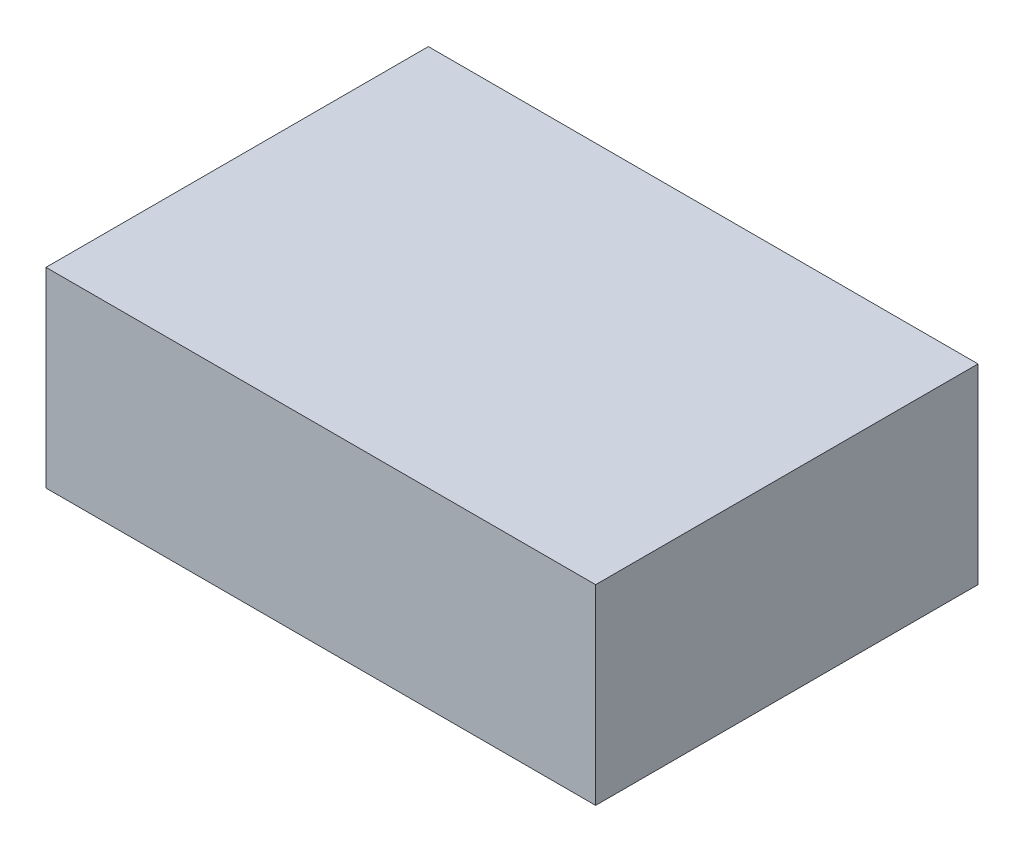
ISO-10303-21;
HEADER;
FILE_DESCRIPTION(('STEP AP214'),'2;1');
FILE_NAME('part.step','',(''),(''),'','','');
FILE_SCHEMA(('AUTOMOTIVE_DESIGN { 1 0 10303 214 1 1 1 1 }'));
ENDSEC;
DATA;
#1=APPLICATION_CONTEXT('core data for automotive mechanical design processes');
#2=APPLICATION_PROTOCOL_DEFINITION('international standard','automotive_design',2000,#1);
#3=PRODUCT_CONTEXT('',#1,'mechanical');
#4=PRODUCT('Part','Part','',(#3));
#5=PRODUCT_RELATED_PRODUCT_CATEGORY('part','',(#4));
#6=PRODUCT_DEFINITION_FORMATION('','',#4);
#7=PRODUCT_DEFINITION_CONTEXT('part definition',#1,'design');
#8=PRODUCT_DEFINITION('design','',#6,#7);
#9=PRODUCT_DEFINITION_SHAPE('','',#8);
#10=(LENGTH_UNIT() NAMED_UNIT(*) SI_UNIT(.MILLI.,.METRE.));
#11=(NAMED_UNIT(*) PLANE_ANGLE_UNIT() SI_UNIT($,.RADIAN.));
#12=(NAMED_UNIT(*) SI_UNIT($,.STERADIAN.) SOLID_ANGLE_UNIT());
#13=UNCERTAINTY_MEASURE_WITH_UNIT(LENGTH_MEASURE(1.E-05),#10,'distance_accuracy_value','');
#14=(GEOMETRIC_REPRESENTATION_CONTEXT(3) GLOBAL_UNCERTAINTY_ASSIGNED_CONTEXT((#13)) GLOBAL_UNIT_ASSIGNED_CONTEXT((#10,
#11,#12)) REPRESENTATION_CONTEXT('',''));
#15=CARTESIAN_POINT('',(0.,0.,0.));
#16=DIRECTION('',(0.,0.,1.));
#17=DIRECTION('',(1.,0.,0.));
#18=AXIS2_PLACEMENT_3D('',#15,#16,#17);
#19=CARTESIAN_POINT('',(0.,12.7,0.));
#20=DIRECTION('',(1.,0.,0.));
#21=DIRECTION('',(0.,0.,-1.));
#22=AXIS2_PLACEMENT_3D('',#19,#20,#21);
#23=PLANE('',#22);
#24=DIRECTION('',(0.,0.,-1.));
#25=VECTOR('',#24,1.);
#26=CARTESIAN_POINT('',(0.,-25.4,-25.4));
#27=LINE('',#26,#25);
#28=CARTESIAN_POINT('',(0.,-25.4,-25.4));
#29=VERTEX_POINT('',#28);
#30=CARTESIAN_POINT('',(0.,-25.4,-177.8));
#31=VERTEX_POINT('',#30);
#32=EDGE_CURVE('E141',#29,#31,#27,.T.);
#33=ORIENTED_EDGE('',*,*,#32,.F.);
#34=DIRECTION('',(0.,1.,0.));
#35=VECTOR('',#34,1.);
#36=CARTESIAN_POINT('',(0.,-88.9,-25.4));
#37=LINE('',#36,#35);
#38=CARTESIAN_POINT('',(0.,-88.9,-25.4));
#39=VERTEX_POINT('',#38);
#40=EDGE_CURVE('E124',#39,#29,#37,.T.);
#41=ORIENTED_EDGE('',*,*,#40,.F.);
#42=DIRECTION('',(0.,0.,-1.));
#43=VECTOR('',#42,1.);
#44=CARTESIAN_POINT('',(0.,-88.9,0.));
#45=LINE('',#44,#43);
#46=CARTESIAN_POINT('',(0.,-88.9,0.));
#47=VERTEX_POINT('',#46);
#48=EDGE_CURVE('E138',#47,#39,#45,.T.);
#49=ORIENTED_EDGE('',*,*,#48,.F.);
#50=DIRECTION('',(0.,-1.,0.));
#51=VECTOR('',#50,1.);
#52=CARTESIAN_POINT('',(0.,12.7,0.));
#53=LINE('',#52,#51);
#54=CARTESIAN_POINT('',(0.,12.7,0.));
#55=VERTEX_POINT('',#54);
#56=EDGE_CURVE('E11',#55,#47,#53,.T.);
#57=ORIENTED_EDGE('',*,*,#56,.F.);
#58=DIRECTION('',(0.,0.,1.));
#59=VECTOR('',#58,1.);
#60=CARTESIAN_POINT('',(0.,12.7,0.));
#61=LINE('',#60,#59);
#62=CARTESIAN_POINT('',(0.,12.7,-203.2));
#63=VERTEX_POINT('',#62);
#64=EDGE_CURVE('E157',#63,#55,#61,.T.);
#65=ORIENTED_EDGE('',*,*,#64,.F.);
#66=DIRECTION('',(0.,-1.,0.));
#67=VECTOR('',#66,1.);
#68=CARTESIAN_POINT('',(0.,12.7,-203.2));
#69=LINE('',#68,#67);
#70=CARTESIAN_POINT('',(0.,-88.9,-203.2));
#71=VERTEX_POINT('',#70);
#72=EDGE_CURVE('E166',#63,#71,#69,.T.);
#73=ORIENTED_EDGE('',*,*,#72,.T.);
#74=CARTESIAN_POINT('',(0.,-88.9,-177.8));
#75=VERTEX_POINT('',#74);
#76=EDGE_CURVE('E148',#75,#71,#45,.T.);
#77=ORIENTED_EDGE('',*,*,#76,.F.);
#78=DIRECTION('',(0.,-1.,0.));
#79=VECTOR('',#78,1.);
#80=CARTESIAN_POINT('',(0.,-88.9,-177.8));
#81=LINE('',#80,#79);
#82=EDGE_CURVE('E202',#31,#75,#81,.T.);
#83=ORIENTED_EDGE('',*,*,#82,.F.);
#84=EDGE_LOOP('',(#33,#41,#49,#57,#65,#73,#77,#83));
#85=FACE_BOUND('',#84,.T.);
#86=ADVANCED_FACE('F33',(#85),#23,.F.);
#87=CARTESIAN_POINT('',(0.,12.7,0.));
#88=DIRECTION('',(0.,0.,-1.));
#89=DIRECTION('',(-1.,0.,0.));
#90=AXIS2_PLACEMENT_3D('',#87,#88,#89);
#91=PLANE('',#90);
#92=ORIENTED_EDGE('',*,*,#56,.T.);
#93=DIRECTION('',(-1.,0.,0.));
#94=VECTOR('',#93,1.);
#95=CARTESIAN_POINT('',(292.1,-88.9,0.));
#96=LINE('',#95,#94);
#97=CARTESIAN_POINT('',(292.1,-88.9,0.));
#98=VERTEX_POINT('',#97);
#99=EDGE_CURVE('E146',#98,#47,#96,.T.);
#100=ORIENTED_EDGE('',*,*,#99,.F.);
#101=DIRECTION('',(0.,-1.,0.));
#102=VECTOR('',#101,1.);
#103=CARTESIAN_POINT('',(292.1,12.7,0.));
#104=LINE('',#103,#102);
#105=CARTESIAN_POINT('',(292.1,12.7,0.));
#106=VERTEX_POINT('',#105);
#107=EDGE_CURVE('E40',#106,#98,#104,.T.);
#108=ORIENTED_EDGE('',*,*,#107,.F.);
#109=DIRECTION('',(1.,0.,0.));
#110=VECTOR('',#109,1.);
#111=CARTESIAN_POINT('',(0.,12.7,0.));
#112=LINE('',#111,#110);
#113=EDGE_CURVE('E160',#55,#106,#112,.T.);
#114=ORIENTED_EDGE('',*,*,#113,.F.);
#115=EDGE_LOOP('',(#92,#100,#108,#114));
#116=FACE_BOUND('',#115,.T.);
#117=ADVANCED_FACE('F178',(#116),#91,.F.);
#118=CARTESIAN_POINT('',(292.1,12.7,0.));
#119=DIRECTION('',(-1.,0.,0.));
#120=DIRECTION('',(0.,0.,1.));
#121=AXIS2_PLACEMENT_3D('',#118,#119,#120);
#122=PLANE('',#121);
#123=ORIENTED_EDGE('',*,*,#107,.T.);
#124=DIRECTION('',(0.,0.,1.));
#125=VECTOR('',#124,1.);
#126=CARTESIAN_POINT('',(292.1,-88.9,-203.2));
#127=LINE('',#126,#125);
#128=CARTESIAN_POINT('',(292.1,-88.9,-203.2));
#129=VERTEX_POINT('',#128);
#130=EDGE_CURVE('E151',#129,#98,#127,.T.);
#131=ORIENTED_EDGE('',*,*,#130,.F.);
#132=DIRECTION('',(0.,-1.,0.));
#133=VECTOR('',#132,1.);
#134=CARTESIAN_POINT('',(292.1,12.7,-203.2));
#135=LINE('',#134,#133);
#136=CARTESIAN_POINT('',(292.1,12.7,-203.2));
#137=VERTEX_POINT('',#136);
#138=EDGE_CURVE('E169',#137,#129,#135,.T.);
#139=ORIENTED_EDGE('',*,*,#138,.F.);
#140=DIRECTION('',(0.,0.,-1.));
#141=VECTOR('',#140,1.);
#142=CARTESIAN_POINT('',(292.1,12.7,0.));
#143=LINE('',#142,#141);
#144=EDGE_CURVE('E162',#106,#137,#143,.T.);
#145=ORIENTED_EDGE('',*,*,#144,.F.);
#146=EDGE_LOOP('',(#123,#131,#139,#145));
#147=FACE_BOUND('',#146,.T.);
#148=ADVANCED_FACE('F174',(#147),#122,.F.);
#149=CARTESIAN_POINT('',(0.,12.7,-203.2));
#150=DIRECTION('',(0.,0.,1.));
#151=DIRECTION('',(1.,0.,0.));
#152=AXIS2_PLACEMENT_3D('',#149,#150,#151);
#153=PLANE('',#152);
#154=ORIENTED_EDGE('',*,*,#138,.T.);
#155=DIRECTION('',(1.,0.,0.));
#156=VECTOR('',#155,1.);
#157=CARTESIAN_POINT('',(0.,-88.9,-203.2));
#158=LINE('',#157,#156);
#159=EDGE_CURVE('E147',#71,#129,#158,.T.);
#160=ORIENTED_EDGE('',*,*,#159,.F.);
#161=ORIENTED_EDGE('',*,*,#72,.F.);
#162=DIRECTION('',(-1.,0.,0.));
#163=VECTOR('',#162,1.);
#164=CARTESIAN_POINT('',(0.,12.7,-203.2));
#165=LINE('',#164,#163);
#166=EDGE_CURVE('E164',#137,#63,#165,.T.);
#167=ORIENTED_EDGE('',*,*,#166,.F.);
#168=EDGE_LOOP('',(#154,#160,#161,#167));
#169=FACE_BOUND('',#168,.T.);
#170=ADVANCED_FACE('F259',(#169),#153,.F.);
#171=CARTESIAN_POINT('',(0.,12.7,0.));
#172=DIRECTION('',(0.,-1.,0.));
#173=DIRECTION('',(0.,0.,-1.));
#174=AXIS2_PLACEMENT_3D('',#171,#172,#173);
#175=PLANE('',#174);
#176=ORIENTED_EDGE('',*,*,#64,.T.);
#177=ORIENTED_EDGE('',*,*,#113,.T.);
#178=ORIENTED_EDGE('',*,*,#144,.T.);
#179=ORIENTED_EDGE('',*,*,#166,.T.);
#180=EDGE_LOOP('',(#176,#177,#178,#179));
#181=FACE_BOUND('',#180,.T.);
#182=ADVANCED_FACE('F263',(#181),#175,.F.);
#183=CARTESIAN_POINT('',(0.,-88.9,0.));
#184=DIRECTION('',(0.,-1.,0.));
#185=DIRECTION('',(0.,0.,-1.));
#186=AXIS2_PLACEMENT_3D('',#183,#184,#185);
#187=PLANE('',#186);
#188=DIRECTION('',(-1.,0.,0.));
#189=VECTOR('',#188,1.);
#190=CARTESIAN_POINT('',(292.101,-88.9,-25.4));
#191=LINE('',#190,#189);
#192=CARTESIAN_POINT('',(12.7,-88.9,-25.4));
#193=VERTEX_POINT('',#192);
#194=EDGE_CURVE('E120',#193,#39,#191,.T.);
#195=ORIENTED_EDGE('',*,*,#194,.F.);
#196=DIRECTION('',(0.,0.,-1.));
#197=VECTOR('',#196,1.);
#198=CARTESIAN_POINT('',(12.7,-88.9,-12.7));
#199=LINE('',#198,#197);
#200=CARTESIAN_POINT('',(12.7,-88.9,-12.7));
#201=VERTEX_POINT('',#200);
#202=EDGE_CURVE('E207',#201,#193,#199,.T.);
#203=ORIENTED_EDGE('',*,*,#202,.F.);
#204=DIRECTION('',(-1.,0.,0.));
#205=VECTOR('',#204,1.);
#206=CARTESIAN_POINT('',(279.4,-88.9,-12.7));
#207=LINE('',#206,#205);
#208=CARTESIAN_POINT('',(279.4,-88.9,-12.7));
#209=VERTEX_POINT('',#208);
#210=EDGE_CURVE('E196',#209,#201,#207,.T.);
#211=ORIENTED_EDGE('',*,*,#210,.F.);
#212=DIRECTION('',(0.,0.,1.));
#213=VECTOR('',#212,1.);
#214=CARTESIAN_POINT('',(279.4,-88.9,-190.5));
#215=LINE('',#214,#213);
#216=CARTESIAN_POINT('',(279.4,-88.9,-190.5));
#217=VERTEX_POINT('',#216);
#218=EDGE_CURVE('E193',#217,#209,#215,.T.);
#219=ORIENTED_EDGE('',*,*,#218,.F.);
#220=DIRECTION('',(1.,0.,0.));
#221=VECTOR('',#220,1.);
#222=CARTESIAN_POINT('',(12.7,-88.9,-190.5));
#223=LINE('',#222,#221);
#224=CARTESIAN_POINT('',(12.7,-88.9,-190.5));
#225=VERTEX_POINT('',#224);
#226=EDGE_CURVE('E204',#225,#217,#223,.T.);
#227=ORIENTED_EDGE('',*,*,#226,.F.);
#228=CARTESIAN_POINT('',(12.7,-88.9,-177.8));
#229=VERTEX_POINT('',#228);
#230=EDGE_CURVE('E209',#229,#225,#199,.T.);
#231=ORIENTED_EDGE('',*,*,#230,.F.);
#232=DIRECTION('',(-1.,0.,0.));
#233=VECTOR('',#232,1.);
#234=CARTESIAN_POINT('',(292.101,-88.9,-177.8));
#235=LINE('',#234,#233);
#236=EDGE_CURVE('E214',#229,#75,#235,.T.);
#237=ORIENTED_EDGE('',*,*,#236,.T.);
#238=ORIENTED_EDGE('',*,*,#76,.T.);
#239=ORIENTED_EDGE('',*,*,#159,.T.);
#240=ORIENTED_EDGE('',*,*,#130,.T.);
#241=ORIENTED_EDGE('',*,*,#99,.T.);
#242=ORIENTED_EDGE('',*,*,#48,.T.);
#243=EDGE_LOOP('',(#195,#203,#211,#219,#227,#231,#237,#238,#239,#240,#241,#242));
#244=FACE_BOUND('',#243,.T.);
#245=ADVANCED_FACE('F143',(#244),#187,.T.);
#246=CARTESIAN_POINT('',(279.4,-88.9,-12.7));
#247=DIRECTION('',(0.,0.,-1.));
#248=DIRECTION('',(-1.,0.,0.));
#249=AXIS2_PLACEMENT_3D('',#246,#247,#248);
#250=PLANE('',#249);
#251=DIRECTION('',(-1.,0.,0.));
#252=VECTOR('',#251,1.);
#253=CARTESIAN_POINT('',(279.4,0.,-12.7));
#254=LINE('',#253,#252);
#255=CARTESIAN_POINT('',(279.4,0.,-12.7));
#256=VERTEX_POINT('',#255);
#257=CARTESIAN_POINT('',(12.7,0.,-12.7));
#258=VERTEX_POINT('',#257);
#259=EDGE_CURVE('E55',#256,#258,#254,.T.);
#260=ORIENTED_EDGE('',*,*,#259,.F.);
#261=DIRECTION('',(0.,1.,0.));
#262=VECTOR('',#261,1.);
#263=CARTESIAN_POINT('',(279.4,-88.9,-12.7));
#264=LINE('',#263,#262);
#265=EDGE_CURVE('E190',#209,#256,#264,.T.);
#266=ORIENTED_EDGE('',*,*,#265,.F.);
#267=ORIENTED_EDGE('',*,*,#210,.T.);
#268=DIRECTION('',(0.,1.,0.));
#269=VECTOR('',#268,1.);
#270=CARTESIAN_POINT('',(12.7,-88.9,-12.7));
#271=LINE('',#270,#269);
#272=EDGE_CURVE('E179',#201,#258,#271,.T.);
#273=ORIENTED_EDGE('',*,*,#272,.T.);
#274=EDGE_LOOP('',(#260,#266,#267,#273));
#275=FACE_BOUND('',#274,.T.);
#276=ADVANCED_FACE('F240',(#275),#250,.T.);
#277=CARTESIAN_POINT('',(12.7,-88.9,-12.7));
#278=DIRECTION('',(1.,0.,0.));
#279=DIRECTION('',(0.,0.,-1.));
#280=AXIS2_PLACEMENT_3D('',#277,#278,#279);
#281=PLANE('',#280);
#282=DIRECTION('',(0.,1.,0.));
#283=VECTOR('',#282,1.);
#284=CARTESIAN_POINT('',(12.7,-88.9,-25.4));
#285=LINE('',#284,#283);
#286=CARTESIAN_POINT('',(12.7,-25.4,-25.4));
#287=VERTEX_POINT('',#286);
#288=EDGE_CURVE('E127',#193,#287,#285,.T.);
#289=ORIENTED_EDGE('',*,*,#288,.T.);
#290=DIRECTION('',(0.,0.,-1.));
#291=VECTOR('',#290,1.);
#292=CARTESIAN_POINT('',(12.7,-25.4,-25.4));
#293=LINE('',#292,#291);
#294=CARTESIAN_POINT('',(12.7,-25.4,-177.8));
#295=VERTEX_POINT('',#294);
#296=EDGE_CURVE('E213',#287,#295,#293,.T.);
#297=ORIENTED_EDGE('',*,*,#296,.T.);
#298=DIRECTION('',(0.,-1.,0.));
#299=VECTOR('',#298,1.);
#300=CARTESIAN_POINT('',(12.7,-88.9,-177.8));
#301=LINE('',#300,#299);
#302=EDGE_CURVE('E132',#295,#229,#301,.T.);
#303=ORIENTED_EDGE('',*,*,#302,.T.);
#304=ORIENTED_EDGE('',*,*,#230,.T.);
#305=DIRECTION('',(0.,1.,0.));
#306=VECTOR('',#305,1.);
#307=CARTESIAN_POINT('',(12.7,-88.9,-190.5));
#308=LINE('',#307,#306);
#309=CARTESIAN_POINT('',(12.7,0.,-190.5));
#310=VERTEX_POINT('',#309);
#311=EDGE_CURVE('E181',#225,#310,#308,.T.);
#312=ORIENTED_EDGE('',*,*,#311,.T.);
#313=DIRECTION('',(0.,0.,-1.));
#314=VECTOR('',#313,1.);
#315=CARTESIAN_POINT('',(12.7,0.,-12.7));
#316=LINE('',#315,#314);
#317=EDGE_CURVE('E199',#258,#310,#316,.T.);
#318=ORIENTED_EDGE('',*,*,#317,.F.);
#319=ORIENTED_EDGE('',*,*,#272,.F.);
#320=ORIENTED_EDGE('',*,*,#202,.T.);
#321=EDGE_LOOP('',(#289,#297,#303,#304,#312,#318,#319,#320));
#322=FACE_BOUND('',#321,.T.);
#323=ADVANCED_FACE('F224',(#322),#281,.T.);
#324=CARTESIAN_POINT('',(12.7,-88.9,-190.5));
#325=DIRECTION('',(0.,0.,1.));
#326=DIRECTION('',(1.,0.,0.));
#327=AXIS2_PLACEMENT_3D('',#324,#325,#326);
#328=PLANE('',#327);
#329=DIRECTION('',(1.,0.,0.));
#330=VECTOR('',#329,1.);
#331=CARTESIAN_POINT('',(12.7,0.,-190.5));
#332=LINE('',#331,#330);
#333=CARTESIAN_POINT('',(279.4,0.,-190.5));
#334=VERTEX_POINT('',#333);
#335=EDGE_CURVE('E197',#310,#334,#332,.T.);
#336=ORIENTED_EDGE('',*,*,#335,.F.);
#337=ORIENTED_EDGE('',*,*,#311,.F.);
#338=ORIENTED_EDGE('',*,*,#226,.T.);
#339=DIRECTION('',(0.,1.,0.));
#340=VECTOR('',#339,1.);
#341=CARTESIAN_POINT('',(279.4,-88.9,-190.5));
#342=LINE('',#341,#340);
#343=EDGE_CURVE('E185',#217,#334,#342,.T.);
#344=ORIENTED_EDGE('',*,*,#343,.T.);
#345=EDGE_LOOP('',(#336,#337,#338,#344));
#346=FACE_BOUND('',#345,.T.);
#347=ADVANCED_FACE('F235',(#346),#328,.T.);
#348=CARTESIAN_POINT('',(279.4,-88.9,-190.5));
#349=DIRECTION('',(-1.,0.,0.));
#350=DIRECTION('',(0.,0.,1.));
#351=AXIS2_PLACEMENT_3D('',#348,#349,#350);
#352=PLANE('',#351);
#353=DIRECTION('',(0.,0.,1.));
#354=VECTOR('',#353,1.);
#355=CARTESIAN_POINT('',(279.4,0.,-190.5));
#356=LINE('',#355,#354);
#357=EDGE_CURVE('E194',#334,#256,#356,.T.);
#358=ORIENTED_EDGE('',*,*,#357,.F.);
#359=ORIENTED_EDGE('',*,*,#343,.F.);
#360=ORIENTED_EDGE('',*,*,#218,.T.);
#361=ORIENTED_EDGE('',*,*,#265,.T.);
#362=EDGE_LOOP('',(#358,#359,#360,#361));
#363=FACE_BOUND('',#362,.T.);
#364=ADVANCED_FACE('F242',(#363),#352,.T.);
#365=CARTESIAN_POINT('',(0.,0.,0.));
#366=DIRECTION('',(0.,-1.,0.));
#367=DIRECTION('',(0.,0.,-1.));
#368=AXIS2_PLACEMENT_3D('',#365,#366,#367);
#369=PLANE('',#368);
#370=ORIENTED_EDGE('',*,*,#259,.T.);
#371=ORIENTED_EDGE('',*,*,#317,.T.);
#372=ORIENTED_EDGE('',*,*,#335,.T.);
#373=ORIENTED_EDGE('',*,*,#357,.T.);
#374=EDGE_LOOP('',(#370,#371,#372,#373));
#375=FACE_BOUND('',#374,.T.);
#376=ADVANCED_FACE('F237',(#375),#369,.T.);
#377=CARTESIAN_POINT('',(292.101,-88.9,-25.4));
#378=DIRECTION('',(0.,0.,1.));
#379=DIRECTION('',(0.,-1.,0.));
#380=AXIS2_PLACEMENT_3D('',#377,#378,#379);
#381=PLANE('',#380);
#382=ORIENTED_EDGE('',*,*,#194,.T.);
#383=ORIENTED_EDGE('',*,*,#40,.T.);
#384=DIRECTION('',(-1.,0.,0.));
#385=VECTOR('',#384,1.);
#386=CARTESIAN_POINT('',(292.101,-25.4,-25.4));
#387=LINE('',#386,#385);
#388=EDGE_CURVE('E133',#287,#29,#387,.T.);
#389=ORIENTED_EDGE('',*,*,#388,.F.);
#390=ORIENTED_EDGE('',*,*,#288,.F.);
#391=EDGE_LOOP('',(#382,#383,#389,#390));
#392=FACE_BOUND('',#391,.T.);
#393=ADVANCED_FACE('F122',(#392),#381,.F.);
#394=CARTESIAN_POINT('',(292.101,-88.9,-177.8));
#395=DIRECTION('',(0.,0.,-1.));
#396=DIRECTION('',(0.,1.,0.));
#397=AXIS2_PLACEMENT_3D('',#394,#395,#396);
#398=PLANE('',#397);
#399=DIRECTION('',(-1.,0.,0.));
#400=VECTOR('',#399,1.);
#401=CARTESIAN_POINT('',(292.101,-25.4,-177.8));
#402=LINE('',#401,#400);
#403=EDGE_CURVE('E47',#295,#31,#402,.T.);
#404=ORIENTED_EDGE('',*,*,#403,.T.);
#405=ORIENTED_EDGE('',*,*,#82,.T.);
#406=ORIENTED_EDGE('',*,*,#236,.F.);
#407=ORIENTED_EDGE('',*,*,#302,.F.);
#408=EDGE_LOOP('',(#404,#405,#406,#407));
#409=FACE_BOUND('',#408,.T.);
#410=ADVANCED_FACE('F229',(#409),#398,.F.);
#411=CARTESIAN_POINT('',(292.101,-25.4,-25.4));
#412=DIRECTION('',(0.,1.,0.));
#413=DIRECTION('',(0.,0.,1.));
#414=AXIS2_PLACEMENT_3D('',#411,#412,#413);
#415=PLANE('',#414);
#416=ORIENTED_EDGE('',*,*,#388,.T.);
#417=ORIENTED_EDGE('',*,*,#32,.T.);
#418=ORIENTED_EDGE('',*,*,#403,.F.);
#419=ORIENTED_EDGE('',*,*,#296,.F.);
#420=EDGE_LOOP('',(#416,#417,#418,#419));
#421=FACE_BOUND('',#420,.T.);
#422=ADVANCED_FACE('F226',(#421),#415,.F.);
#423=CLOSED_SHELL('',(#86,#117,#148,#170,#182,#245,#276,#323,#347,#364,#376,#393,#410,#422));
#424=MANIFOLD_SOLID_BREP('B2',#423);
#425=ADVANCED_BREP_SHAPE_REPRESENTATION('',(#18,#424),#14);
#426=SHAPE_DEFINITION_REPRESENTATION(#9,#425);
ENDSEC;
END-ISO-10303-21;
